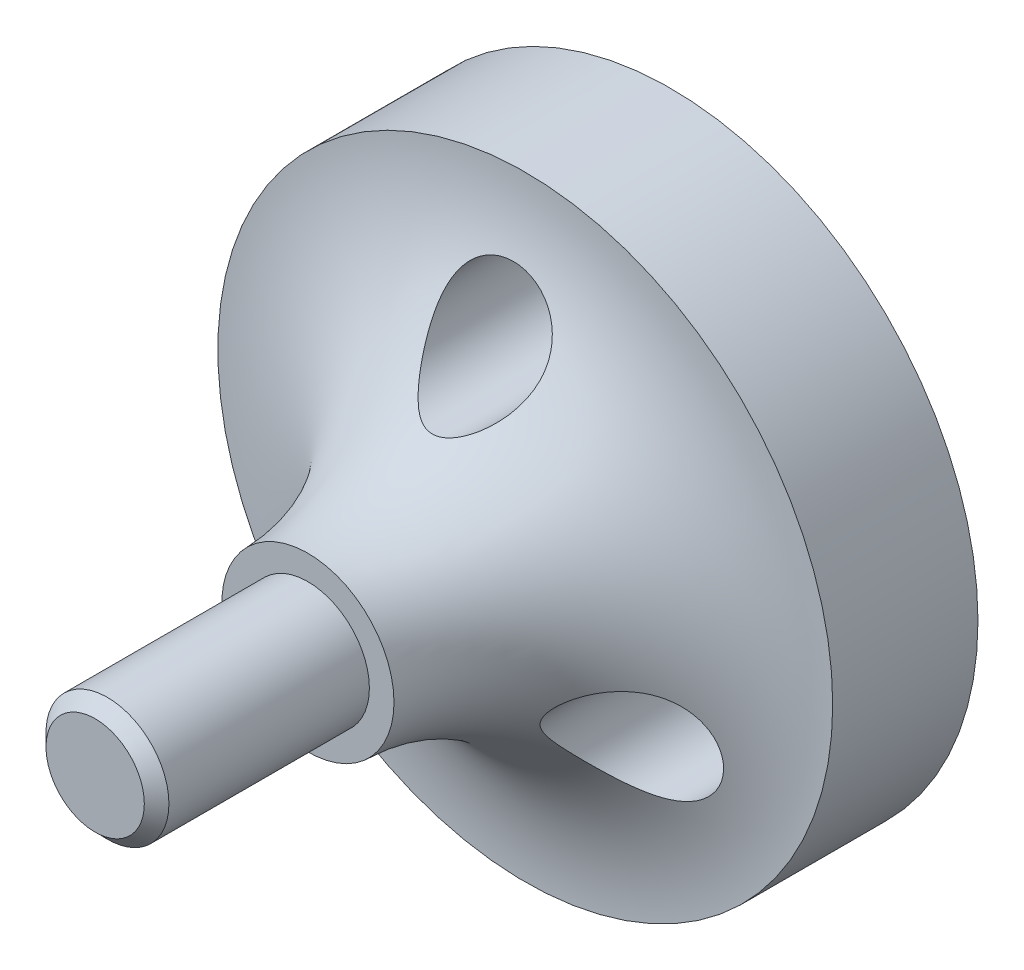
ISO-10303-21;
HEADER;
FILE_DESCRIPTION(('STEP AP214'),'2;1');
FILE_NAME('part.step','',(''),(''),'','','');
FILE_SCHEMA(('AUTOMOTIVE_DESIGN { 1 0 10303 214 1 1 1 1 }'));
ENDSEC;
DATA;
#1=APPLICATION_CONTEXT('core data for automotive mechanical design processes');
#2=APPLICATION_PROTOCOL_DEFINITION('international standard','automotive_design',2000,#1);
#3=PRODUCT_CONTEXT('',#1,'mechanical');
#4=PRODUCT('Part','Part','',(#3));
#5=PRODUCT_RELATED_PRODUCT_CATEGORY('part','',(#4));
#6=PRODUCT_DEFINITION_FORMATION('','',#4);
#7=PRODUCT_DEFINITION_CONTEXT('part definition',#1,'design');
#8=PRODUCT_DEFINITION('design','',#6,#7);
#9=PRODUCT_DEFINITION_SHAPE('','',#8);
#10=(LENGTH_UNIT() NAMED_UNIT(*) SI_UNIT(.MILLI.,.METRE.));
#11=(NAMED_UNIT(*) PLANE_ANGLE_UNIT() SI_UNIT($,.RADIAN.));
#12=(NAMED_UNIT(*) SI_UNIT($,.STERADIAN.) SOLID_ANGLE_UNIT());
#13=UNCERTAINTY_MEASURE_WITH_UNIT(LENGTH_MEASURE(1.E-05),#10,'distance_accuracy_value','');
#14=(GEOMETRIC_REPRESENTATION_CONTEXT(3) GLOBAL_UNCERTAINTY_ASSIGNED_CONTEXT((#13)) GLOBAL_UNIT_ASSIGNED_CONTEXT((#10,
#11,#12)) REPRESENTATION_CONTEXT('',''));
#15=CARTESIAN_POINT('',(0.,0.,0.));
#16=DIRECTION('',(0.,0.,1.));
#17=DIRECTION('',(1.,0.,0.));
#18=AXIS2_PLACEMENT_3D('',#15,#16,#17);
#19=CARTESIAN_POINT('',(-40.0195845164463,34.0748283091062,0.507853862000709));
#20=DIRECTION('',(0.,0.,-1.));
#21=DIRECTION('',(-1.,0.,0.));
#22=AXIS2_PLACEMENT_3D('',#19,#20,#21);
#23=CYLINDRICAL_SURFACE('',#22,6.35);
#24=CARTESIAN_POINT('',(-40.0195845164463,34.0748283091062,0.507853862000709));
#25=DIRECTION('',(0.,0.,-1.));
#26=DIRECTION('',(-1.,0.,0.));
#27=AXIS2_PLACEMENT_3D('',#24,#25,#26);
#28=CIRCLE('',#27,6.35);
#29=CARTESIAN_POINT('',(-45.8961190959622,31.668827200263,0.507853862000709));
#30=VERTEX_POINT('',#29);
#31=CARTESIAN_POINT('',(-40.8741937244126,40.3670570956062,0.507853862000709));
#32=VERTEX_POINT('',#31);
#33=EDGE_CURVE('E109',#30,#32,#28,.T.);
#34=ORIENTED_EDGE('',*,*,#33,.F.);
#35=DIRECTION('',(0.,0.,1.));
#36=VECTOR('',#35,1.);
#37=CARTESIAN_POINT('',(-45.8961190959622,31.668827200263,-0.532146137999291));
#38=LINE('',#37,#36);
#39=CARTESIAN_POINT('',(-45.8961190959622,31.668827200263,-2.03214613799929));
#40=VERTEX_POINT('',#39);
#41=EDGE_CURVE('E56',#30,#40,#38,.F.);
#42=ORIENTED_EDGE('',*,*,#41,.T.);
#43=CARTESIAN_POINT('',(-40.0195845164463,34.0748283091062,-2.03214613799929));
#44=DIRECTION('',(0.,0.,-1.));
#45=DIRECTION('',(-1.,0.,0.));
#46=AXIS2_PLACEMENT_3D('',#43,#44,#45);
#47=CIRCLE('',#46,6.35);
#48=CARTESIAN_POINT('',(-40.8741937244126,40.3670570956062,-2.03214613799929));
#49=VERTEX_POINT('',#48);
#50=EDGE_CURVE('E111',#40,#49,#47,.T.);
#51=ORIENTED_EDGE('',*,*,#50,.T.);
#52=DIRECTION('',(0.,0.,1.));
#53=VECTOR('',#52,1.);
#54=CARTESIAN_POINT('',(-40.8741937244126,40.3670570956062,-0.532146137999291));
#55=LINE('',#54,#53);
#56=EDGE_CURVE('E161',#49,#32,#55,.T.);
#57=ORIENTED_EDGE('',*,*,#56,.T.);
#58=EDGE_LOOP('',(#34,#42,#51,#57));
#59=FACE_BOUND('',#58,.T.);
#60=ADVANCED_FACE('F33',(#59),#23,.F.);
#61=CARTESIAN_POINT('',(-34.9976591448963,30.1886006314499,0.507853862000709));
#62=VERTEX_POINT('',#61);
#63=CARTESIAN_POINT('',(-45.0415098879955,30.1886006314487,0.507853862000709));
#64=VERTEX_POINT('',#63);
#65=EDGE_CURVE('E112',#62,#64,#28,.T.);
#66=ORIENTED_EDGE('',*,*,#65,.F.);
#67=DIRECTION('',(0.,0.,1.));
#68=VECTOR('',#67,1.);
#69=CARTESIAN_POINT('',(-34.9976591448963,30.1886006314499,-0.532146137999291));
#70=LINE('',#69,#68);
#71=CARTESIAN_POINT('',(-34.9976591448963,30.1886006314499,-2.03214613799929));
#72=VERTEX_POINT('',#71);
#73=EDGE_CURVE('E48',#62,#72,#70,.F.);
#74=ORIENTED_EDGE('',*,*,#73,.T.);
#75=CARTESIAN_POINT('',(-45.0415098879955,30.1886006314487,-2.03214613799929));
#76=VERTEX_POINT('',#75);
#77=EDGE_CURVE('E103',#72,#76,#47,.T.);
#78=ORIENTED_EDGE('',*,*,#77,.T.);
#79=DIRECTION('',(0.,0.,1.));
#80=VECTOR('',#79,1.);
#81=CARTESIAN_POINT('',(-45.0415098879955,30.1886006314487,-0.532146137999291));
#82=LINE('',#81,#80);
#83=EDGE_CURVE('E144',#76,#64,#82,.T.);
#84=ORIENTED_EDGE('',*,*,#83,.T.);
#85=EDGE_LOOP('',(#66,#74,#78,#84));
#86=FACE_BOUND('',#85,.T.);
#87=ADVANCED_FACE('F147',(#86),#23,.F.);
#88=CARTESIAN_POINT('',(-40.0195845164463,34.0748283091062,3.96785386200071));
#89=DIRECTION('',(0.,0.,-1.));
#90=DIRECTION('',(-1.,0.,0.));
#91=AXIS2_PLACEMENT_3D('',#88,#89,#90);
#92=CYLINDRICAL_SURFACE('',#91,12.7);
#93=CARTESIAN_POINT('',(-40.0195845164463,34.0748283091062,3.96785386200071));
#94=DIRECTION('',(0.,0.,1.));
#95=DIRECTION('',(1.,0.,0.));
#96=AXIS2_PLACEMENT_3D('',#93,#94,#95);
#97=CIRCLE('',#96,12.7);
#98=CARTESIAN_POINT('',(-27.3195845164463,34.0748283091062,3.96785386200071));
#99=VERTEX_POINT('',#98);
#100=EDGE_CURVE('E409',#99,#99,#97,.T.);
#101=ORIENTED_EDGE('',*,*,#100,.F.);
#102=EDGE_LOOP('',(#101));
#103=FACE_BOUND('',#102,.T.);
#104=CARTESIAN_POINT('',(-40.0195845164463,34.0748283091062,-2.03214613799929));
#105=DIRECTION('',(0.,0.,1.));
#106=DIRECTION('',(1.,0.,0.));
#107=AXIS2_PLACEMENT_3D('',#104,#105,#106);
#108=CIRCLE('',#107,12.7);
#109=CARTESIAN_POINT('',(-27.3195845164463,34.0748283091062,-2.03214613799929));
#110=VERTEX_POINT('',#109);
#111=EDGE_CURVE('E135',#110,#110,#108,.T.);
#112=ORIENTED_EDGE('',*,*,#111,.T.);
#113=EDGE_LOOP('',(#112));
#114=FACE_BOUND('',#113,.T.);
#115=ADVANCED_FACE('F192',(#103,#114),#92,.T.);
#116=CARTESIAN_POINT('',(-40.0195845164463,34.0748283091062,3.96785386200071));
#117=DIRECTION('',(0.,0.,1.));
#118=DIRECTION('',(1.,0.,0.));
#119=AXIS2_PLACEMENT_3D('',#116,#117,#118);
#120=PLANE('',#119);
#121=CARTESIAN_POINT('',(-40.0195845164463,34.0748283091062,3.96785386200071));
#122=DIRECTION('',(0.,0.,1.));
#123=DIRECTION('',(1.,0.,0.));
#124=AXIS2_PLACEMENT_3D('',#121,#122,#123);
#125=CIRCLE('',#124,12.6985093923933);
#126=CARTESIAN_POINT('',(-27.321075124053,34.0748283091062,3.96785386200071));
#127=VERTEX_POINT('',#126);
#128=EDGE_CURVE('E200',#127,#127,#125,.F.);
#129=ORIENTED_EDGE('',*,*,#128,.T.);
#130=EDGE_LOOP('',(#129));
#131=FACE_BOUND('',#130,.T.);
#132=ORIENTED_EDGE('',*,*,#100,.T.);
#133=EDGE_LOOP('',(#132));
#134=FACE_BOUND('',#133,.T.);
#135=ADVANCED_FACE('F224',(#131,#134),#120,.T.);
#136=CARTESIAN_POINT('',(-40.0195845164463,34.0748283091062,-2.03214613799929));
#137=DIRECTION('',(0.,0.,1.));
#138=DIRECTION('',(1.,0.,0.));
#139=AXIS2_PLACEMENT_3D('',#136,#137,#138);
#140=PLANE('',#139);
#141=ORIENTED_EDGE('',*,*,#77,.F.);
#142=CARTESIAN_POINT('',(-33.5243939880626,30.3248283091065,-2.03214613799929));
#143=DIRECTION('',(0.,0.,1.));
#144=DIRECTION('',(1.,0.,0.));
#145=AXIS2_PLACEMENT_3D('',#142,#143,#144);
#146=CIRCLE('',#145,1.47955);
#147=CARTESIAN_POINT('',(-34.1430499369304,31.6688272002632,-2.03214613799929));
#148=VERTEX_POINT('',#147);
#149=EDGE_CURVE('E88',#72,#148,#146,.T.);
#150=ORIENTED_EDGE('',*,*,#149,.T.);
#151=CARTESIAN_POINT('',(-39.1649753084801,40.3670570956062,-2.03214613799929));
#152=VERTEX_POINT('',#151);
#153=EDGE_CURVE('E101',#152,#148,#47,.T.);
#154=ORIENTED_EDGE('',*,*,#153,.F.);
#155=CARTESIAN_POINT('',(-40.0195845164463,41.5748283091062,-2.03214613799929));
#156=DIRECTION('',(0.,0.,1.));
#157=DIRECTION('',(1.,0.,0.));
#158=AXIS2_PLACEMENT_3D('',#155,#156,#157);
#159=CIRCLE('',#158,1.47955);
#160=EDGE_CURVE('E153',#152,#49,#159,.T.);
#161=ORIENTED_EDGE('',*,*,#160,.T.);
#162=ORIENTED_EDGE('',*,*,#50,.F.);
#163=CARTESIAN_POINT('',(-46.5147750448291,30.3248283091059,-2.03214613799929));
#164=DIRECTION('',(0.,0.,1.));
#165=DIRECTION('',(1.,0.,0.));
#166=AXIS2_PLACEMENT_3D('',#163,#164,#165);
#167=CIRCLE('',#166,1.47955);
#168=EDGE_CURVE('E145',#40,#76,#167,.T.);
#169=ORIENTED_EDGE('',*,*,#168,.T.);
#170=EDGE_LOOP('',(#141,#150,#154,#161,#162,#169));
#171=FACE_BOUND('',#170,.T.);
#172=ORIENTED_EDGE('',*,*,#111,.F.);
#173=EDGE_LOOP('',(#172));
#174=FACE_BOUND('',#173,.T.);
#175=ADVANCED_FACE('F98',(#171,#174),#140,.F.);
#176=CARTESIAN_POINT('',(-40.0195845164463,34.0748283091062,12.9467538620007));
#177=DIRECTION('',(0.,0.,1.));
#178=DIRECTION('',(1.,0.,0.));
#179=AXIS2_PLACEMENT_3D('',#176,#177,#178);
#180=PLANE('',#179);
#181=CARTESIAN_POINT('',(-40.0195845164463,34.0748283091062,12.9467538620007));
#182=DIRECTION('',(0.,0.,1.));
#183=DIRECTION('',(1.,0.,0.));
#184=AXIS2_PLACEMENT_3D('',#181,#182,#183);
#185=CIRCLE('',#184,2.53863134657836);
#186=CARTESIAN_POINT('',(-37.480953169868,34.0748283091062,12.9467538620007));
#187=VERTEX_POINT('',#186);
#188=EDGE_CURVE('E163',#187,#187,#185,.T.);
#189=ORIENTED_EDGE('',*,*,#188,.F.);
#190=EDGE_LOOP('',(#189));
#191=FACE_BOUND('',#190,.T.);
#192=CARTESIAN_POINT('',(-40.0195845164463,34.0748283091062,12.9467538620007));
#193=DIRECTION('',(0.,0.,1.));
#194=DIRECTION('',(1.,0.,0.));
#195=AXIS2_PLACEMENT_3D('',#192,#193,#194);
#196=CIRCLE('',#195,3.556);
#197=CARTESIAN_POINT('',(-36.4635845164463,34.0748283091062,12.9467538620007));
#198=VERTEX_POINT('',#197);
#199=EDGE_CURVE('E131',#198,#198,#196,.T.);
#200=ORIENTED_EDGE('',*,*,#199,.T.);
#201=EDGE_LOOP('',(#200));
#202=FACE_BOUND('',#201,.T.);
#203=ADVANCED_FACE('F220',(#191,#202),#180,.T.);
#204=ORIENTED_EDGE('',*,*,#153,.T.);
#205=DIRECTION('',(0.,0.,1.));
#206=VECTOR('',#205,1.);
#207=CARTESIAN_POINT('',(-34.1430499369304,31.6688272002632,-0.532146137999291));
#208=LINE('',#207,#206);
#209=CARTESIAN_POINT('',(-34.1430499369304,31.6688272002632,0.507853862000709));
#210=VERTEX_POINT('',#209);
#211=EDGE_CURVE('E85',#148,#210,#208,.T.);
#212=ORIENTED_EDGE('',*,*,#211,.T.);
#213=CARTESIAN_POINT('',(-39.1649753084801,40.3670570956062,0.507853862000709));
#214=VERTEX_POINT('',#213);
#215=EDGE_CURVE('E114',#214,#210,#28,.T.);
#216=ORIENTED_EDGE('',*,*,#215,.F.);
#217=DIRECTION('',(0.,0.,1.));
#218=VECTOR('',#217,1.);
#219=CARTESIAN_POINT('',(-39.1649753084801,40.3670570956062,-0.532146137999291));
#220=LINE('',#219,#218);
#221=EDGE_CURVE('E108',#214,#152,#220,.F.);
#222=ORIENTED_EDGE('',*,*,#221,.T.);
#223=EDGE_LOOP('',(#204,#212,#216,#222));
#224=FACE_BOUND('',#223,.T.);
#225=ADVANCED_FACE('F107',(#224),#23,.F.);
#226=CARTESIAN_POINT('',(-40.0195845164463,34.0748283091062,0.507853862000709));
#227=DIRECTION('',(0.,0.,-1.));
#228=DIRECTION('',(-1.,0.,0.));
#229=AXIS2_PLACEMENT_3D('',#226,#227,#228);
#230=PLANE('',#229);
#231=CARTESIAN_POINT('',(-33.5243939880626,30.3248283091065,0.507853862000709));
#232=DIRECTION('',(0.,0.,-1.));
#233=DIRECTION('',(-1.,0.,0.));
#234=AXIS2_PLACEMENT_3D('',#231,#232,#233);
#235=CIRCLE('',#234,1.47955);
#236=EDGE_CURVE('E89',#62,#210,#235,.T.);
#237=ORIENTED_EDGE('',*,*,#236,.F.);
#238=ORIENTED_EDGE('',*,*,#65,.T.);
#239=CARTESIAN_POINT('',(-46.5147750448291,30.3248283091059,0.507853862000709));
#240=DIRECTION('',(0.,0.,-1.));
#241=DIRECTION('',(-1.,0.,0.));
#242=AXIS2_PLACEMENT_3D('',#239,#240,#241);
#243=CIRCLE('',#242,1.47955);
#244=EDGE_CURVE('E138',#30,#64,#243,.T.);
#245=ORIENTED_EDGE('',*,*,#244,.F.);
#246=ORIENTED_EDGE('',*,*,#33,.T.);
#247=CARTESIAN_POINT('',(-40.0195845164463,41.5748283091062,0.507853862000709));
#248=DIRECTION('',(0.,0.,-1.));
#249=DIRECTION('',(-1.,0.,0.));
#250=AXIS2_PLACEMENT_3D('',#247,#248,#249);
#251=CIRCLE('',#250,1.47955);
#252=EDGE_CURVE('E155',#214,#32,#251,.T.);
#253=ORIENTED_EDGE('',*,*,#252,.F.);
#254=ORIENTED_EDGE('',*,*,#215,.T.);
#255=EDGE_LOOP('',(#237,#238,#245,#246,#253,#254));
#256=FACE_BOUND('',#255,.T.);
#257=ADVANCED_FACE('F137',(#256),#230,.T.);
#258=CARTESIAN_POINT('',(-40.0195845164463,41.5748283091062,0.967853862000709));
#259=DIRECTION('',(0.,0.,1.));
#260=DIRECTION('',(1.,0.,0.));
#261=AXIS2_PLACEMENT_3D('',#258,#259,#260);
#262=PLANE('',#261);
#263=CARTESIAN_POINT('',(-40.0195845164463,41.5748283091062,0.967853862000709));
#264=DIRECTION('',(0.,0.,1.));
#265=DIRECTION('',(1.,0.,0.));
#266=AXIS2_PLACEMENT_3D('',#263,#264,#265);
#267=CIRCLE('',#266,1.47955);
#268=CARTESIAN_POINT('',(-38.5400345164463,41.5748283091062,0.967853862000709));
#269=VERTEX_POINT('',#268);
#270=EDGE_CURVE('E149',#269,#269,#267,.T.);
#271=ORIENTED_EDGE('',*,*,#270,.F.);
#272=EDGE_LOOP('',(#271));
#273=FACE_BOUND('',#272,.T.);
#274=CARTESIAN_POINT('',(-40.0195845164463,41.5748283091062,0.967853862000709));
#275=DIRECTION('',(0.,0.,1.));
#276=DIRECTION('',(1.,0.,0.));
#277=AXIS2_PLACEMENT_3D('',#274,#275,#276);
#278=CIRCLE('',#277,2.25);
#279=CARTESIAN_POINT('',(-37.7695845164463,41.5748283091062,0.967853862000709));
#280=VERTEX_POINT('',#279);
#281=EDGE_CURVE('E116',#280,#280,#278,.T.);
#282=ORIENTED_EDGE('',*,*,#281,.T.);
#283=EDGE_LOOP('',(#282));
#284=FACE_BOUND('',#283,.T.);
#285=ADVANCED_FACE('F208',(#273,#284),#262,.T.);
#286=CARTESIAN_POINT('',(-40.0195845164463,41.5748283091062,0.967853862000709));
#287=DIRECTION('',(0.,0.,1.));
#288=DIRECTION('',(1.,0.,0.));
#289=AXIS2_PLACEMENT_3D('',#286,#287,#288);
#290=CYLINDRICAL_SURFACE('',#289,2.25);
#291=ORIENTED_EDGE('',*,*,#281,.F.);
#292=EDGE_LOOP('',(#291));
#293=FACE_BOUND('',#292,.T.);
#294=CARTESIAN_POINT('',(-42.2058924693017,42.1063897216274,5.08223381308777));
#295=CARTESIAN_POINT('',(-42.239164546029,41.969521911182,5.14942815946088));
#296=CARTESIAN_POINT('',(-42.2589204738355,41.8320602993078,5.22213607788857));
#297=CARTESIAN_POINT('',(-42.2736327732141,41.56151924504,5.37746356851469));
#298=CARTESIAN_POINT('',(-42.268566908334,41.4284438394619,5.46009196325836));
#299=CARTESIAN_POINT('',(-42.2369063961549,41.1715521944815,5.63308770468873));
#300=CARTESIAN_POINT('',(-42.2104546978442,41.0476804196931,5.72340011392995));
#301=CARTESIAN_POINT('',(-42.13943803061,40.8105966141338,5.91042110814986));
#302=CARTESIAN_POINT('',(-42.0948740575777,40.6973839976976,6.0071293412137));
#303=CARTESIAN_POINT('',(-41.9808742054196,40.4631758941099,6.22312414009203));
#304=CARTESIAN_POINT('',(-41.90839214666,40.3444971648154,6.34332293517559));
#305=CARTESIAN_POINT('',(-41.7857813973512,40.179205758565,6.52574076385759));
#306=CARTESIAN_POINT('',(-41.742535490191,40.1261730487237,6.58697570535901));
#307=CARTESIAN_POINT('',(-41.6515238360502,40.0243651789073,6.70961762561238));
#308=CARTESIAN_POINT('',(-41.6037595448408,39.9755886573085,6.77102454280991));
#309=CARTESIAN_POINT('',(-41.5093924253573,39.8876277085117,6.88640445270021));
#310=CARTESIAN_POINT('',(-41.4632771289501,39.8479835558276,6.94042741239201));
#311=CARTESIAN_POINT('',(-41.3673319327806,39.7721033198496,7.04752977771981));
#312=CARTESIAN_POINT('',(-41.3175034103341,39.7358659840625,7.10060952425532));
#313=CARTESIAN_POINT('',(-41.213914844455,39.6669661352288,7.20497431541174));
#314=CARTESIAN_POINT('',(-41.1601635275131,39.6342960680471,7.2562629896667));
#315=CARTESIAN_POINT('',(-41.0481782715156,39.5726851232828,7.3560636302677));
#316=CARTESIAN_POINT('',(-40.9899478221348,39.5437413886091,7.40457770792532));
#317=CARTESIAN_POINT('',(-40.8694168677371,39.4904700356436,7.49643470000678));
#318=CARTESIAN_POINT('',(-40.8072103627631,39.4660676255077,7.53985600927181));
#319=CARTESIAN_POINT('',(-40.6771271407118,39.4219592449656,7.62022794373303));
#320=CARTESIAN_POINT('',(-40.6092551244585,39.4022494322865,7.65718385613943));
#321=CARTESIAN_POINT('',(-40.4800916199321,39.3716448642283,7.71558704129099));
#322=CARTESIAN_POINT('',(-40.4197601134317,39.359807504069,7.73862132478092));
#323=CARTESIAN_POINT('',(-40.295673369281,39.3409541442761,7.77564426363169));
#324=CARTESIAN_POINT('',(-40.2319247543746,39.3339291577967,7.78964977682905));
#325=CARTESIAN_POINT('',(-40.1019348151846,39.3253869842624,7.80671335031046));
#326=CARTESIAN_POINT('',(-40.0356758508028,39.3239215045948,7.80966863192069));
#327=CARTESIAN_POINT('',(-39.9038062527865,39.3268394130016,7.80381894852335));
#328=CARTESIAN_POINT('',(-39.8381960033901,39.3312260800931,7.79500739043361));
#329=CARTESIAN_POINT('',(-39.7036860776881,39.3459874649251,7.7657296655081));
#330=CARTESIAN_POINT('',(-39.6350824014412,39.3569005213143,7.74421828718735));
#331=CARTESIAN_POINT('',(-39.5026165528987,39.3839748835728,7.69191600772296));
#332=CARTESIAN_POINT('',(-39.4387657388035,39.4001482949921,7.66110371444542));
#333=CARTESIAN_POINT('',(-39.273804972272,39.4492641231446,7.56981780561174));
#334=CARTESIAN_POINT('',(-39.1771627076254,39.4861011385989,7.50349153611508));
#335=CARTESIAN_POINT('',(-38.9952799526797,39.5690063275374,7.36163488803057));
#336=CARTESIAN_POINT('',(-38.9100788306128,39.615105077399,7.28607435625913));
#337=CARTESIAN_POINT('',(-38.7586478822421,39.7094848539747,7.13958519071773));
#338=CARTESIAN_POINT('',(-38.6913653257712,39.7568719160893,7.06915662214388));
#339=CARTESIAN_POINT('',(-38.5633641369578,39.8576897551061,6.9266059228383));
#340=CARTESIAN_POINT('',(-38.502649831617,39.9111244692012,6.85448271333615));
#341=CARTESIAN_POINT('',(-38.3874533084824,40.0239740147362,6.70981321213302));
#342=CARTESIAN_POINT('',(-38.3329761571148,40.0833936350888,6.63726662609156));
#343=CARTESIAN_POINT('',(-38.2303841114155,40.2081598639632,6.49277571957661));
#344=CARTESIAN_POINT('',(-38.1822688396015,40.2735061204396,6.42083136360725));
#345=CARTESIAN_POINT('',(-38.0918181404555,40.4115693686776,6.27679679629607));
#346=CARTESIAN_POINT('',(-38.0496298815549,40.484415008084,6.204736953782));
#347=CARTESIAN_POINT('',(-37.9729878227035,40.6361247023961,6.06281511760013));
#348=CARTESIAN_POINT('',(-37.9385354009616,40.7149898263787,5.99295351747232));
#349=CARTESIAN_POINT('',(-37.8783938566463,40.8781670743755,5.85633726377812));
#350=CARTESIAN_POINT('',(-37.8526801589671,40.9624631167469,5.78957436096331));
#351=CARTESIAN_POINT('',(-37.8109836936725,41.1360253807401,5.65965861106391));
#352=CARTESIAN_POINT('',(-37.7949955533682,41.2252888284146,5.59650378827289));
#353=CARTESIAN_POINT('',(-37.7701627968992,41.4403463440584,5.45270874642313));
#354=CARTESIAN_POINT('',(-37.7658542561439,41.5678807692999,5.37379846212415));
#355=CARTESIAN_POINT('',(-37.7799993280292,41.826962088947,5.2250759170814));
#356=CARTESIAN_POINT('',(-37.7984442456022,41.958507431879,5.15526019218765));
#357=CARTESIAN_POINT('',(-37.8603024281893,42.2216347050806,5.0252781857961));
#358=CARTESIAN_POINT('',(-37.9038632604668,42.3532122170752,4.96517164557858));
#359=CARTESIAN_POINT('',(-38.0167659193344,42.6096265497066,4.85562639741183));
#360=CARTESIAN_POINT('',(-38.0860968091944,42.7344662041663,4.80618317802963));
#361=CARTESIAN_POINT('',(-38.2408389647606,42.9587203000199,4.72248645812821));
#362=CARTESIAN_POINT('',(-38.3238152838989,43.0594284509426,4.68718597191531));
#363=CARTESIAN_POINT('',(-38.5074929811853,43.2461162055022,4.62467771394444));
#364=CARTESIAN_POINT('',(-38.6081875185574,43.3321014682678,4.59746682976098));
#365=CARTESIAN_POINT('',(-38.8174398371166,43.4808143300042,4.55208513851448));
#366=CARTESIAN_POINT('',(-38.9250998160421,43.5446675529126,4.53345205359401));
#367=CARTESIAN_POINT('',(-39.1502475897734,43.6538660231387,4.50236223898135));
#368=CARTESIAN_POINT('',(-39.2677337630336,43.6992143169576,4.48990449255901));
#369=CARTESIAN_POINT('',(-39.5063375816704,43.7689531011676,4.47101043239952));
#370=CARTESIAN_POINT('',(-39.6273143928564,43.79379143893,4.46444515840272));
#371=CARTESIAN_POINT('',(-39.8718698593994,43.8233495314552,4.45665279903297));
#372=CARTESIAN_POINT('',(-39.9954484032751,43.8280701464838,4.45542548540032));
#373=CARTESIAN_POINT('',(-40.240876157667,43.8172655388574,4.45825918468858));
#374=CARTESIAN_POINT('',(-40.3627313515842,43.8018669279777,4.46228712567742));
#375=CARTESIAN_POINT('',(-40.6020384583433,43.7515679772976,4.47570408814461));
#376=CARTESIAN_POINT('',(-40.7194904647196,43.7166680520033,4.48509299567421));
#377=CARTESIAN_POINT('',(-40.9467453616666,43.6285402167995,4.50951860431204));
#378=CARTESIAN_POINT('',(-41.0565441928093,43.5753026677966,4.52455827609855));
#379=CARTESIAN_POINT('',(-41.2653946681714,43.452363995783,4.56066882307005));
#380=CARTESIAN_POINT('',(-41.3644465046962,43.3826631674349,4.58173959031088));
#381=CARTESIAN_POINT('',(-41.5499427785504,43.2286562541604,4.63052471190826));
#382=CARTESIAN_POINT('',(-41.6362820653331,43.1442397380909,4.65828995504175));
#383=CARTESIAN_POINT('',(-41.793371933711,42.9642361877492,4.72074585552661));
#384=CARTESIAN_POINT('',(-41.8641217174845,42.8686485821585,4.75543686714399));
#385=CARTESIAN_POINT('',(-41.991893206777,42.6646443024566,4.8339167895387));
#386=CARTESIAN_POINT('',(-42.0480414848436,42.5558235737792,4.8780766010669));
#387=CARTESIAN_POINT('',(-42.1412117923025,42.3336033704807,4.97429567404792));
#388=CARTESIAN_POINT('',(-42.1782251480212,42.220201844495,5.02635850405385));
#389=CARTESIAN_POINT('',(-42.2058924693017,42.1063897216274,5.08223381308777));
#390=B_SPLINE_CURVE_WITH_KNOTS('',3,(#294,#295,#296,#297,#298,#299,#300,#301,#302,#303,#304,
#305,#306,#307,#308,#309,#310,#311,#312,#313,#314,#315,#316,#317,#318,#319,#320,#321,#322,#323,
#324,#325,#326,#327,#328,#329,#330,#331,#332,#333,#334,#335,#336,#337,#338,#339,#340,#341,#342,
#343,#344,#345,#346,#347,#348,#349,#350,#351,#352,#353,#354,#355,#356,#357,#358,#359,#360,#361,
#362,#363,#364,#365,#366,#367,#368,#369,#370,#371,#372,#373,#374,#375,#376,#377,#378,#379,#380,
#381,#382,#383,#384,#385,#386,#387,#388,#389),.UNSPECIFIED.,.T.,.F.,(4,2,2,2,2,2,2,2,2,2,2,2,2,
2,2,2,2,2,2,2,2,2,2,2,2,2,2,2,2,2,2,2,2,2,2,2,2,2,2,2,2,2,2,2,2,2,2,4),(0.,0.467641085404361,
0.935701180785273,1.4006582440393,1.86558974539646,2.41490450797262,2.69023203210776,
2.96547114906909,3.20935582113643,3.45315047712281,3.69641842346224,3.93949872383541,
4.17812997936143,4.41656516773886,4.61281957426352,4.80870647991204,5.00641086959537,
5.20422608158927,5.42118208703204,5.63864094410577,6.00518806482987,6.37296578676408,
6.69749866023233,7.02224404250478,7.34725137072961,7.67223940597018,8.00424201819793,
8.33630373282551,8.66742374033161,8.99836066073128,9.44651552450006,9.89449918220666,
10.3451421628546,10.7955941100223,11.1990116065711,11.6022736892081,11.9800761123467,
12.357816312046,12.7270722447428,13.0963123873124,13.4632400289753,13.8301598717837,
14.1972728795093,14.5643793170807,14.9343695785685,15.3043787706011,15.6930686381989,
16.0819345409765),.UNSPECIFIED.);
#391=CARTESIAN_POINT('',(-42.2058924693017,42.1063897216274,5.08223381308777));
#392=VERTEX_POINT('',#391);
#393=EDGE_CURVE('E122',#392,#392,#390,.T.);
#394=ORIENTED_EDGE('',*,*,#393,.T.);
#395=EDGE_LOOP('',(#394));
#396=FACE_BOUND('',#395,.T.);
#397=ADVANCED_FACE('F202',(#293,#396),#290,.F.);
#398=CARTESIAN_POINT('',(-46.5147750448291,30.3248283091059,0.967853862000709));
#399=DIRECTION('',(0.,0.,1.));
#400=DIRECTION('',(1.,0.,0.));
#401=AXIS2_PLACEMENT_3D('',#398,#399,#400);
#402=PLANE('',#401);
#403=CARTESIAN_POINT('',(-46.5147750448291,30.3248283091059,0.967853862000709));
#404=DIRECTION('',(0.,0.,1.));
#405=DIRECTION('',(1.,0.,0.));
#406=AXIS2_PLACEMENT_3D('',#403,#404,#405);
#407=CIRCLE('',#406,1.47955);
#408=CARTESIAN_POINT('',(-45.0352250448291,30.3248283091059,0.967853862000709));
#409=VERTEX_POINT('',#408);
#410=EDGE_CURVE('E235',#409,#409,#407,.T.);
#411=ORIENTED_EDGE('',*,*,#410,.F.);
#412=EDGE_LOOP('',(#411));
#413=FACE_BOUND('',#412,.T.);
#414=CARTESIAN_POINT('',(-46.5147750448291,30.3248283091059,0.967853862000709));
#415=DIRECTION('',(0.,0.,1.));
#416=DIRECTION('',(1.,0.,0.));
#417=AXIS2_PLACEMENT_3D('',#414,#415,#416);
#418=CIRCLE('',#417,2.25);
#419=CARTESIAN_POINT('',(-44.2647750448291,30.3248283091059,0.967853862000709));
#420=VERTEX_POINT('',#419);
#421=EDGE_CURVE('E127',#420,#420,#418,.T.);
#422=ORIENTED_EDGE('',*,*,#421,.T.);
#423=EDGE_LOOP('',(#422));
#424=FACE_BOUND('',#423,.T.);
#425=ADVANCED_FACE('F207',(#413,#424),#402,.T.);
#426=CARTESIAN_POINT('',(-46.5147750448291,30.3248283091059,0.967853862000709));
#427=DIRECTION('',(0.,0.,1.));
#428=DIRECTION('',(1.,0.,0.));
#429=AXIS2_PLACEMENT_3D('',#426,#427,#428);
#430=CYLINDRICAL_SURFACE('',#429,2.25);
#431=ORIENTED_EDGE('',*,*,#421,.F.);
#432=EDGE_LOOP('',(#431));
#433=FACE_BOUND('',#432,.T.);
#434=CARTESIAN_POINT('',(-48.7634833717314,30.2485993085824,4.52905688024794));
#435=CARTESIAN_POINT('',(-48.7593653110169,30.1273047030342,4.51257194823051));
#436=CARTESIAN_POINT('',(-48.7453845320864,30.0058184760399,4.49903358237727));
#437=CARTESIAN_POINT('',(-48.6977366609759,29.7661193813479,4.47751332213073));
#438=CARTESIAN_POINT('',(-48.6640379310992,29.64791209474,4.46954040275384));
#439=CARTESIAN_POINT('',(-48.5777569685804,29.4183956445114,4.45893119177901));
#440=CARTESIAN_POINT('',(-48.5251840216798,29.3070831203241,4.45629228018015));
#441=CARTESIAN_POINT('',(-48.4026222350982,29.0945524003297,4.45625984432671));
#442=CARTESIAN_POINT('',(-48.3326392262598,28.993330840801,4.45886456598239));
#443=CARTESIAN_POINT('',(-48.1774512747095,28.8039866472155,4.46938962085979));
#444=CARTESIAN_POINT('',(-48.0922778512994,28.7158375691973,4.47729903918252));
#445=CARTESIAN_POINT('',(-47.9091663417402,28.554788797848,4.49866557224007));
#446=CARTESIAN_POINT('',(-47.8112278615107,28.4818895754886,4.51212285827533));
#447=CARTESIAN_POINT('',(-47.6053192093811,28.3530264867829,4.54499083947267));
#448=CARTESIAN_POINT('',(-47.4973229402451,28.2971083772297,4.56441734098979));
#449=CARTESIAN_POINT('',(-47.2749051994704,28.2036841538085,4.60963056001937));
#450=CARTESIAN_POINT('',(-47.1604837604645,28.1661779464382,4.63541724523149));
#451=CARTESIAN_POINT('',(-46.9273507875852,28.1096889956194,4.69410547076698));
#452=CARTESIAN_POINT('',(-46.808603723033,28.0909407355114,4.72709094584205));
#453=CARTESIAN_POINT('',(-46.5718776473596,28.0724203911321,4.80026238455766));
#454=CARTESIAN_POINT('',(-46.4538986905799,28.0726496351875,4.84044885203386));
#455=CARTESIAN_POINT('',(-46.2180926458736,28.0912330261968,4.92962187437505));
#456=CARTESIAN_POINT('',(-46.1004133500173,28.110216840044,4.97886573888583));
#457=CARTESIAN_POINT('',(-45.8727278495983,28.1651969558294,5.08492757021612));
#458=CARTESIAN_POINT('',(-45.762723683221,28.2011977571655,5.14174753735037));
#459=CARTESIAN_POINT('',(-45.5446249632733,28.2910437806932,5.2671531804165));
#460=CARTESIAN_POINT('',(-45.437344003544,28.3460588692732,5.33631018142964));
#461=CARTESIAN_POINT('',(-45.2363671391732,28.4695368619852,5.48188015294443));
#462=CARTESIAN_POINT('',(-45.1426765063887,28.5380049605867,5.55829592029146));
#463=CARTESIAN_POINT('',(-44.9576492401978,28.695528421373,5.72832445764316));
#464=CARTESIAN_POINT('',(-44.8684706955055,28.7861236334816,5.82284820121476));
#465=CARTESIAN_POINT('',(-44.7089172288272,28.9769127394098,6.01795423219745));
#466=CARTESIAN_POINT('',(-44.6385582899357,29.0771146945561,6.11854158103311));
#467=CARTESIAN_POINT('',(-44.5405736280934,29.243039882438,6.28269719700917));
#468=CARTESIAN_POINT('',(-44.5070892959619,29.3065993719984,6.34505242042045));
#469=CARTESIAN_POINT('',(-44.4466046601183,29.4358611945003,6.47067636099217));
#470=CARTESIAN_POINT('',(-44.4196036136121,29.5015632809826,6.53394497262378));
#471=CARTESIAN_POINT('',(-44.3719774944851,29.6349446608391,6.6608804403904));
#472=CARTESIAN_POINT('',(-44.35135630721,29.7026251317039,6.72454751520838));
#473=CARTESIAN_POINT('',(-44.3165197239225,29.8398732266122,6.8515368307455));
#474=CARTESIAN_POINT('',(-44.3023025651577,29.9094403257518,6.91485916161095));
#475=CARTESIAN_POINT('',(-44.2760063441521,30.0789371608377,7.06552476942034));
#476=CARTESIAN_POINT('',(-44.2670601211179,30.1798758694563,7.15233922161295));
#477=CARTESIAN_POINT('',(-44.2642077627059,30.3349934872708,7.27806800101658));
#478=CARTESIAN_POINT('',(-44.2650158614754,30.3872973426244,7.31921421202263));
#479=CARTESIAN_POINT('',(-44.2704674719421,30.4933657505492,7.39929622887626));
#480=CARTESIAN_POINT('',(-44.275109368603,30.5471296788241,7.43823295811611));
#481=CARTESIAN_POINT('',(-44.2903721285301,30.6702340252367,7.52246498624733));
#482=CARTESIAN_POINT('',(-44.3022135639394,30.74005771894,7.5668581547277));
#483=CARTESIAN_POINT('',(-44.3337631390212,30.882487875798,7.64776831617176));
#484=CARTESIAN_POINT('',(-44.3534575971118,30.9550893017319,7.6842988379367));
#485=CARTESIAN_POINT('',(-44.3958481236159,31.0837745903662,7.73759983273556));
#486=CARTESIAN_POINT('',(-44.4165273857957,31.1393952759152,7.75703099642145));
#487=CARTESIAN_POINT('',(-44.4632397092677,31.2507501093306,7.78711390760806));
#488=CARTESIAN_POINT('',(-44.4892635634419,31.306483901003,7.79778059768477));
#489=CARTESIAN_POINT('',(-44.5465234919841,31.416782343178,7.80891277874995));
#490=CARTESIAN_POINT('',(-44.5777921461678,31.471337117148,7.80931193568839));
#491=CARTESIAN_POINT('',(-44.64433943363,31.576978357282,7.7996757732131));
#492=CARTESIAN_POINT('',(-44.6796215054119,31.6280617886037,7.78963144543822));
#493=CARTESIAN_POINT('',(-44.7597281023959,31.7346363599916,7.75780191958299));
#494=CARTESIAN_POINT('',(-44.8050983318918,31.7891456294032,7.73416174367155));
#495=CARTESIAN_POINT('',(-44.8979488259799,31.8910849246501,7.67758234551501));
#496=CARTESIAN_POINT('',(-44.9454339865058,31.9384972842743,7.64462048891634));
#497=CARTESIAN_POINT('',(-45.0348281593411,32.0205289928804,7.57748403768392));
#498=CARTESIAN_POINT('',(-45.0765836144821,32.0560098526886,7.54413001848602));
#499=CARTESIAN_POINT('',(-45.1607896098654,32.1226336387707,7.47409923695494));
#500=CARTESIAN_POINT('',(-45.2032406549803,32.1537732426729,7.43741996484118));
#501=CARTESIAN_POINT('',(-45.3317117555617,32.2415109800151,7.32376805510088));
#502=CARTESIAN_POINT('',(-45.4186658683526,32.2922643397048,7.24332849804401));
#503=CARTESIAN_POINT('',(-45.5824406371053,32.3743095155011,7.09007240201834));
#504=CARTESIAN_POINT('',(-45.6589395753387,32.407343999131,7.0178030331444));
#505=CARTESIAN_POINT('',(-45.8140119348227,32.464515937663,6.87186157482287));
#506=CARTESIAN_POINT('',(-45.892586645924,32.4886477142579,6.79818862153419));
#507=CARTESIAN_POINT('',(-46.0517552883706,32.5281960155245,6.65081085396355));
#508=CARTESIAN_POINT('',(-46.1323478176617,32.5436184253946,6.57710609495782));
#509=CARTESIAN_POINT('',(-46.2955418771489,32.5656351222176,6.43053481836808));
#510=CARTESIAN_POINT('',(-46.3781439851418,32.5722268388709,6.3576685509547));
#511=CARTESIAN_POINT('',(-46.5324347982787,32.575874513842,6.22447441907559));
#512=CARTESIAN_POINT('',(-46.6038916567467,32.5742181132277,6.16391222479287));
#513=CARTESIAN_POINT('',(-46.7476766422964,32.5639019697001,6.04444883040674));
#514=CARTESIAN_POINT('',(-46.8200046070806,32.5552435120617,5.98554732752542));
#515=CARTESIAN_POINT('',(-46.9649705506251,32.5305525298993,5.86990490616972));
#516=CARTESIAN_POINT('',(-47.0376079076727,32.5145310009233,5.81316090215199));
#517=CARTESIAN_POINT('',(-47.1826342728097,32.4747399255482,5.70216867022718));
#518=CARTESIAN_POINT('',(-47.2550233285582,32.4509719610796,5.64791993533018));
#519=CARTESIAN_POINT('',(-47.4443105732339,32.3777022778962,5.50885023064042));
#520=CARTESIAN_POINT('',(-47.5604187802614,32.3214308566054,5.42638056761786));
#521=CARTESIAN_POINT('',(-47.7855546686453,32.1862282039326,5.27060005117134));
#522=CARTESIAN_POINT('',(-47.8945840984384,32.1073025943763,5.19728693194445));
#523=CARTESIAN_POINT('',(-48.0489838454596,31.9720839078205,5.09488283871512));
#524=CARTESIAN_POINT('',(-48.0990954052776,31.9239954298109,5.06190073094336));
#525=CARTESIAN_POINT('',(-48.1954088639483,31.8224456841613,4.99863895346015));
#526=CARTESIAN_POINT('',(-48.241612593487,31.7689869582676,4.96835801797338));
#527=CARTESIAN_POINT('',(-48.329408149102,31.6569955799794,4.9105450479155));
#528=CARTESIAN_POINT('',(-48.3709986721379,31.5984615022835,4.88301379023254));
#529=CARTESIAN_POINT('',(-48.4488483201895,31.4768186208075,4.83073613707834));
#530=CARTESIAN_POINT('',(-48.4851082810133,31.4137105365327,4.80598930516485));
#531=CARTESIAN_POINT('',(-48.5772999983668,31.2332416307007,4.74125214558967));
#532=CARTESIAN_POINT('',(-48.6269054007403,31.111493443899,4.70418098516992));
#533=CARTESIAN_POINT('',(-48.7043158739284,30.8593842566213,4.63845174548983));
#534=CARTESIAN_POINT('',(-48.7321705871247,30.7290436093438,4.60977460241314));
#535=CARTESIAN_POINT('',(-48.7552895596697,30.5392235961633,4.57424622059296));
#536=CARTESIAN_POINT('',(-48.7600761713172,30.4813620634351,4.56422424280185));
#537=CARTESIAN_POINT('',(-48.7651632293339,30.3652148916158,4.54559333981279));
#538=CARTESIAN_POINT('',(-48.7654637258377,30.3069292572713,4.53698439882448));
#539=CARTESIAN_POINT('',(-48.7634833717314,30.2485993085824,4.52905688024794));
#540=B_SPLINE_CURVE_WITH_KNOTS('',3,(#434,#435,#436,#437,#438,#439,#440,#441,#442,#443,#444,
#445,#446,#447,#448,#449,#450,#451,#452,#453,#454,#455,#456,#457,#458,#459,#460,#461,#462,#463,
#464,#465,#466,#467,#468,#469,#470,#471,#472,#473,#474,#475,#476,#477,#478,#479,#480,#481,#482,
#483,#484,#485,#486,#487,#488,#489,#490,#491,#492,#493,#494,#495,#496,#497,#498,#499,#500,#501,
#502,#503,#504,#505,#506,#507,#508,#509,#510,#511,#512,#513,#514,#515,#516,#517,#518,#519,#520,
#521,#522,#523,#524,#525,#526,#527,#528,#529,#530,#531,#532,#533,#534,#535,#536,#537,#538,#539),
.UNSPECIFIED.,.T.,.F.,(4,2,2,2,2,2,2,2,2,2,2,2,2,2,2,2,2,2,2,2,2,2,2,2,2,2,2,2,2,2,2,2,2,2,2,2,
2,2,2,2,2,2,2,2,2,2,2,2,2,2,2,2,4),(0.,0.367218502350869,0.735027833345094,1.10265645684229,
1.47016212238066,1.83691392184023,2.20367704627249,2.57141984532094,2.9391607768181,
3.31144327139559,3.68375182383777,4.06900022316738,4.45435054161347,4.86966467186591,
5.28513947925595,5.75866718610834,6.23259578228045,6.5177555815936,6.8028826943652,
7.08818310979796,7.37340494628868,7.7727757744398,7.97231182847737,8.1717638682545,
8.42195339819832,8.67170893775213,8.85833844134387,9.0446490956584,9.23216312156692,
9.41983902797876,9.64286167938179,9.86643058061322,10.0585985012033,10.2509126903057,
10.6363928786813,10.9669415251299,11.2977006384485,11.6282359789615,11.9588675056271,
12.239659572371,12.520400109529,12.8007227619179,13.0809882043334,13.5384161587552,
13.9957306966124,14.2261073940631,14.4563755630654,14.6867086085852,14.9170055003204,
15.3244723814604,15.7310065457644,15.9076019984934,16.0841954776752),.UNSPECIFIED.);
#541=CARTESIAN_POINT('',(-48.7634833717314,30.2485993085824,4.52905688024794));
#542=VERTEX_POINT('',#541);
#543=EDGE_CURVE('E168',#542,#542,#540,.T.);
#544=ORIENTED_EDGE('',*,*,#543,.T.);
#545=EDGE_LOOP('',(#544));
#546=FACE_BOUND('',#545,.T.);
#547=ADVANCED_FACE('F247',(#433,#546),#430,.F.);
#548=CARTESIAN_POINT('',(-33.5243939880626,30.3248283091065,0.967853862000709));
#549=DIRECTION('',(0.,0.,1.));
#550=DIRECTION('',(1.,0.,0.));
#551=AXIS2_PLACEMENT_3D('',#548,#549,#550);
#552=PLANE('',#551);
#553=CARTESIAN_POINT('',(-33.5243939880626,30.3248283091065,0.967853862000709));
#554=DIRECTION('',(0.,0.,1.));
#555=DIRECTION('',(1.,0.,0.));
#556=AXIS2_PLACEMENT_3D('',#553,#554,#555);
#557=CIRCLE('',#556,1.47955);
#558=CARTESIAN_POINT('',(-32.0448439880626,30.3248283091065,0.967853862000709));
#559=VERTEX_POINT('',#558);
#560=EDGE_CURVE('E104',#559,#559,#557,.T.);
#561=ORIENTED_EDGE('',*,*,#560,.F.);
#562=EDGE_LOOP('',(#561));
#563=FACE_BOUND('',#562,.T.);
#564=CARTESIAN_POINT('',(-33.5243939880626,30.3248283091065,0.967853862000709));
#565=DIRECTION('',(0.,0.,1.));
#566=DIRECTION('',(1.,0.,0.));
#567=AXIS2_PLACEMENT_3D('',#564,#565,#566);
#568=CIRCLE('',#567,2.25);
#569=CARTESIAN_POINT('',(-31.2743939880626,30.3248283091065,0.967853862000709));
#570=VERTEX_POINT('',#569);
#571=EDGE_CURVE('E166',#570,#570,#568,.T.);
#572=ORIENTED_EDGE('',*,*,#571,.T.);
#573=EDGE_LOOP('',(#572));
#574=FACE_BOUND('',#573,.T.);
#575=ADVANCED_FACE('F245',(#563,#574),#552,.T.);
#576=CARTESIAN_POINT('',(-33.5243939880626,30.3248283091065,0.967853862000709));
#577=DIRECTION('',(0.,0.,1.));
#578=DIRECTION('',(1.,0.,0.));
#579=AXIS2_PLACEMENT_3D('',#576,#577,#578);
#580=CYLINDRICAL_SURFACE('',#579,2.25);
#581=ORIENTED_EDGE('',*,*,#571,.F.);
#582=EDGE_LOOP('',(#581));
#583=FACE_BOUND('',#582,.T.);
#584=CARTESIAN_POINT('',(-35.2180782753319,28.8436350283166,5.88155711961516));
#585=CARTESIAN_POINT('',(-35.168117223268,28.7865071029044,5.82281721293471));
#586=CARTESIAN_POINT('',(-35.1146718177364,28.7312265473511,5.76522241900637));
#587=CARTESIAN_POINT('',(-35.00080045962,28.6251873834331,5.65274237992021));
#588=CARTESIAN_POINT('',(-34.940371382152,28.5744308174853,5.59785836351549));
#589=CARTESIAN_POINT('',(-34.8127057872432,28.4784466915347,5.49123898536154));
#590=CARTESIAN_POINT('',(-34.7454700427839,28.4332185050007,5.43950326715003));
#591=CARTESIAN_POINT('',(-34.6046047828091,28.3493877085096,5.33958483377153));
#592=CARTESIAN_POINT('',(-34.5309784447536,28.3107818339785,5.29140037467542));
#593=CARTESIAN_POINT('',(-34.3435862692306,28.2257334083162,5.17816632912219));
#594=CARTESIAN_POINT('',(-34.2265827463199,28.183494874257,5.1151990487142));
#595=CARTESIAN_POINT('',(-33.9832009280216,28.118508468886,4.99810681473801));
#596=CARTESIAN_POINT('',(-33.8568304533714,28.0957445324907,4.94397460279216));
#597=CARTESIAN_POINT('',(-33.5979917792959,28.0722677022795,4.84457875202267));
#598=CARTESIAN_POINT('',(-33.465500546403,28.0716462911068,4.7993526736008));
#599=CARTESIAN_POINT('',(-33.1997449000105,28.0943851053062,4.71796748815663));
#600=CARTESIAN_POINT('',(-33.0664805444468,28.117743556188,4.68180771048185));
#601=CARTESIAN_POINT('',(-32.8141984890904,28.1861541355225,4.62050227133623));
#602=CARTESIAN_POINT('',(-32.6948575128262,28.2294674449786,4.5947383228603));
#603=CARTESIAN_POINT('',(-32.4641577824415,28.336225507802,4.5501435883859));
#604=CARTESIAN_POINT('',(-32.3527968928231,28.3996648505268,4.53131094192606));
#605=CARTESIAN_POINT('',(-32.145841026662,28.5423298480986,4.50067910338954));
#606=CARTESIAN_POINT('',(-32.0498122669814,28.6208766202918,4.48864327420884));
#607=CARTESIAN_POINT('',(-31.8717090927195,28.7930106132882,4.47019587410348));
#608=CARTESIAN_POINT('',(-31.7896334884253,28.8865965504553,4.46378382347438));
#609=CARTESIAN_POINT('',(-31.6428416620324,29.0849481014165,4.45642064266997));
#610=CARTESIAN_POINT('',(-31.5779282655596,29.1895654885775,4.45540467001362));
#611=CARTESIAN_POINT('',(-31.4660414181324,29.4079141283335,4.45862520827216));
#612=CARTESIAN_POINT('',(-31.4190675175847,29.5216451524394,4.46286158754315));
#613=CARTESIAN_POINT('',(-31.3444049635568,29.7546683963746,4.47670815122447));
#614=CARTESIAN_POINT('',(-31.3166724653427,29.8739473076567,4.48630602780838));
#615=CARTESIAN_POINT('',(-31.2809075683714,30.1148402967149,4.5111512869155));
#616=CARTESIAN_POINT('',(-31.2728747756597,30.2364543277442,4.52639855645518));
#617=CARTESIAN_POINT('',(-31.276393273886,30.4789337500128,4.56299805096249));
#618=CARTESIAN_POINT('',(-31.2880178799533,30.5997946437708,4.58437288247239));
#619=CARTESIAN_POINT('',(-31.3301126574535,30.8368020361729,4.63362559850119));
#620=CARTESIAN_POINT('',(-31.3605829345455,30.9529485083814,4.66150351947944));
#621=CARTESIAN_POINT('',(-31.4393304650965,31.1789590513637,4.7245925450733));
#622=CARTESIAN_POINT('',(-31.4878636435866,31.2887052442576,4.75990571095803));
#623=CARTESIAN_POINT('',(-31.6002877531849,31.4971531173576,4.83783009721043));
#624=CARTESIAN_POINT('',(-31.6641800388833,31.5958538222855,4.88044196118845));
#625=CARTESIAN_POINT('',(-31.8072472125461,31.7837316519516,4.97481064131845));
#626=CARTESIAN_POINT('',(-31.8869306268813,31.8723708538057,5.02686476635088));
#627=CARTESIAN_POINT('',(-32.0562888693419,32.0338858981805,5.13854638650381));
#628=CARTESIAN_POINT('',(-32.1459668582572,32.1067567323918,5.19817627830389));
#629=CARTESIAN_POINT('',(-32.3399314736234,32.2417770835936,5.32986093775976));
#630=CARTESIAN_POINT('',(-32.4448108460177,32.3024563602942,5.40254407453009));
#631=CARTESIAN_POINT('',(-32.6584632174285,32.4049059701144,5.55504160939972));
#632=CARTESIAN_POINT('',(-32.7672374543915,32.4466702326615,5.63485828710654));
#633=CARTESIAN_POINT('',(-33.00203779116,32.5172814197353,5.81277279529378));
#634=CARTESIAN_POINT('',(-33.1282039040745,32.5432504752943,5.91181679601217));
#635=CARTESIAN_POINT('',(-33.3786175099191,32.573650520987,6.11565265953213));
#636=CARTESIAN_POINT('',(-33.5028623599239,32.5780540890267,6.22045166920517));
#637=CARTESIAN_POINT('',(-33.6991627564157,32.5692528073106,6.39127022111374));
#638=CARTESIAN_POINT('',(-33.7724656125183,32.5623107261327,6.45627346942359));
#639=CARTESIAN_POINT('',(-33.9174959728825,32.5414334983974,6.58690675764437));
#640=CARTESIAN_POINT('',(-33.989223710133,32.5274993934609,6.6525367027664));
#641=CARTESIAN_POINT('',(-34.1309992906269,32.4927437971039,6.78371468960239));
#642=CARTESIAN_POINT('',(-34.2010478874786,32.4719254598785,6.84926275505134));
#643=CARTESIAN_POINT('',(-34.3395100792518,32.4232726200929,6.97942296543011));
#644=CARTESIAN_POINT('',(-34.4079243847062,32.3954412296637,7.04403551209453));
#645=CARTESIAN_POINT('',(-34.5514117271198,32.3285115816129,7.17885211987535));
#646=CARTESIAN_POINT('',(-34.6262939468699,32.2884598773284,7.24879196966654));
#647=CARTESIAN_POINT('',(-34.7743329225267,32.1977125840145,7.38355814452434));
#648=CARTESIAN_POINT('',(-34.8474903711878,32.1470213522506,7.44838654800478));
#649=CARTESIAN_POINT('',(-34.9755519404623,32.0457902486946,7.55493170300005));
#650=CARTESIAN_POINT('',(-35.0308477847865,31.9978005684695,7.59856179024154));
#651=CARTESIAN_POINT('',(-35.139618180229,31.8930173667255,7.67662345901238));
#652=CARTESIAN_POINT('',(-35.1930969996641,31.8362465105756,7.71107811731117));
#653=CARTESIAN_POINT('',(-35.2815285309557,31.731318160594,7.75807325627557));
#654=CARTESIAN_POINT('',(-35.3173414456387,31.6854659610684,7.77407343949436));
#655=CARTESIAN_POINT('',(-35.386169385368,31.5896431692221,7.79731709774578));
#656=CARTESIAN_POINT('',(-35.4191885600201,31.53967891043,7.80457377980779));
#657=CARTESIAN_POINT('',(-35.4813998885541,31.436699252535,7.80935924488688));
#658=CARTESIAN_POINT('',(-35.5105771213438,31.3836730450741,7.80685119316541));
#659=CARTESIAN_POINT('',(-35.5641161071695,31.2764777723395,7.79239568965262));
#660=CARTESIAN_POINT('',(-35.5884724200212,31.2223074914315,7.7804376490738));
#661=CARTESIAN_POINT('',(-35.6385025671844,31.09858914981,7.74393315316221));
#662=CARTESIAN_POINT('',(-35.6624908208804,31.0291614714202,7.7167332645883));
#663=CARTESIAN_POINT('',(-35.7028054057307,30.8924057926773,7.65298962459747));
#664=CARTESIAN_POINT('',(-35.7191114482177,30.8250837858049,7.6164215201738));
#665=CARTESIAN_POINT('',(-35.7435795514699,30.7006569297406,7.54177378284895));
#666=CARTESIAN_POINT('',(-35.7524703867815,30.6432771502162,7.50436958687431));
#667=CARTESIAN_POINT('',(-35.7657195346376,30.5302556554186,7.4262316454067));
#668=CARTESIAN_POINT('',(-35.7700742067695,30.4746153708232,7.3854952539534));
#669=CARTESIAN_POINT('',(-35.7747137047818,30.3647373224658,7.30166020117625));
#670=CARTESIAN_POINT('',(-35.7749866986073,30.3105040909488,7.25855503556035));
#671=CARTESIAN_POINT('',(-35.7717526733704,30.2033834527743,7.17083015696618));
#672=CARTESIAN_POINT('',(-35.768244504742,30.1504964604116,7.12620998738501));
#673=CARTESIAN_POINT('',(-35.7543729108977,30.0134417134437,7.00802768178863));
#674=CARTESIAN_POINT('',(-35.7411064200497,29.9302281119442,6.93368772707226));
#675=CARTESIAN_POINT('',(-35.7056195114482,29.766463790508,6.7841480706577));
#676=CARTESIAN_POINT('',(-35.6833933359726,29.6859148190163,6.70894784637933));
#677=CARTESIAN_POINT('',(-35.6301204730279,29.5277356529314,6.55911967891396));
#678=CARTESIAN_POINT('',(-35.5991015908275,29.4500971172706,6.48449068145098));
#679=CARTESIAN_POINT('',(-35.5280929112215,29.2978233940791,6.33654358093139));
#680=CARTESIAN_POINT('',(-35.4881099676375,29.2231859630861,6.26322452230967));
#681=CARTESIAN_POINT('',(-35.4109452182635,29.0970990775899,6.13811036120507));
#682=CARTESIAN_POINT('',(-35.3759036647455,29.0448133976781,6.08583128423836));
#683=CARTESIAN_POINT('',(-35.3007827732014,28.9424471652542,5.98260846144211));
#684=CARTESIAN_POINT('',(-35.2606983435112,28.8923689115204,5.93166612901658));
#685=CARTESIAN_POINT('',(-35.2180782753319,28.8436350283166,5.88155711961516));
#686=B_SPLINE_CURVE_WITH_KNOTS('',3,(#584,#585,#586,#587,#588,#589,#590,#591,#592,#593,#594,
#595,#596,#597,#598,#599,#600,#601,#602,#603,#604,#605,#606,#607,#608,#609,#610,#611,#612,#613,
#614,#615,#616,#617,#618,#619,#620,#621,#622,#623,#624,#625,#626,#627,#628,#629,#630,#631,#632,
#633,#634,#635,#636,#637,#638,#639,#640,#641,#642,#643,#644,#645,#646,#647,#648,#649,#650,#651,
#652,#653,#654,#655,#656,#657,#658,#659,#660,#661,#662,#663,#664,#665,#666,#667,#668,#669,#670,
#671,#672,#673,#674,#675,#676,#677,#678,#679,#680,#681,#682,#683,#684,#685),.UNSPECIFIED.,.T.,
.F.,(4,2,2,2,2,2,2,2,2,2,2,2,2,2,2,2,2,2,2,2,2,2,2,2,2,2,2,2,2,2,2,2,2,2,2,2,2,2,2,2,2,2,2,2,2,
2,2,2,2,2,4),(0.,0.287829257654318,0.575787808448017,0.863713694584793,1.15149723261009,
1.56784674010929,1.98385245837431,2.40157672088013,2.81927007436095,3.20596153508491,
3.59254912642027,3.96468327209971,4.33678567190568,4.70440638107744,5.0720178764633,
5.43878893226085,5.80555265331363,6.17368729206944,6.54182399480828,6.91538856538341,
7.28898609442846,7.67750732721939,8.06615178060608,8.48837412485907,8.91073188102363,
9.39645280013271,9.88279118882078,10.1772148472893,10.4715946576787,10.7658397765359,
11.0599545496456,11.3895042135006,11.7189191774557,11.9739545058958,12.2283422136764,
12.4086576091928,12.5887002960776,12.7694228006771,12.9503480938956,13.1840134951379,
13.4182925928938,13.6252074366243,13.8322882083485,14.0399691541689,14.2477132578953,
14.5843704577712,14.9212443479252,15.2570646004094,15.5926289588525,15.8379165951921,
16.0834539103306),.UNSPECIFIED.);
#687=CARTESIAN_POINT('',(-35.2180782753319,28.8436350283166,5.88155711961516));
#688=VERTEX_POINT('',#687);
#689=EDGE_CURVE('E165',#688,#688,#686,.T.);
#690=ORIENTED_EDGE('',*,*,#689,.T.);
#691=EDGE_LOOP('',(#690));
#692=FACE_BOUND('',#691,.T.);
#693=ADVANCED_FACE('F183',(#583,#692),#580,.F.);
#694=CARTESIAN_POINT('',(-40.0195845164463,34.0748283091062,28.9154876223939));
#695=DIRECTION('',(0.,0.,-1.));
#696=DIRECTION('',(-1.,0.,0.));
#697=AXIS2_PLACEMENT_3D('',#694,#695,#696);
#698=CYLINDRICAL_SURFACE('',#697,2.53863134657836);
#699=CARTESIAN_POINT('',(-40.0195845164463,34.0748283091062,21.2271538620007));
#700=DIRECTION('',(0.,0.,1.));
#701=DIRECTION('',(1.,0.,0.));
#702=AXIS2_PLACEMENT_3D('',#699,#700,#701);
#703=CIRCLE('',#702,2.53863134657836);
#704=CARTESIAN_POINT('',(-37.480953169868,34.0748283091062,21.2271538620007));
#705=VERTEX_POINT('',#704);
#706=EDGE_CURVE('E11',#705,#705,#703,.F.);
#707=ORIENTED_EDGE('',*,*,#706,.T.);
#708=EDGE_LOOP('',(#707));
#709=FACE_BOUND('',#708,.T.);
#710=ORIENTED_EDGE('',*,*,#188,.T.);
#711=EDGE_LOOP('',(#710));
#712=FACE_BOUND('',#711,.T.);
#713=ADVANCED_FACE('F214',(#709,#712),#698,.T.);
#714=CARTESIAN_POINT('',(-40.0195845164463,34.0748283091062,21.7351538620007));
#715=DIRECTION('',(0.,0.,1.));
#716=DIRECTION('',(1.,0.,0.));
#717=AXIS2_PLACEMENT_3D('',#714,#715,#716);
#718=PLANE('',#717);
#719=CARTESIAN_POINT('',(-40.0195845164463,34.0748283091062,21.7351538620007));
#720=DIRECTION('',(0.,0.,1.));
#721=DIRECTION('',(1.,0.,0.));
#722=AXIS2_PLACEMENT_3D('',#719,#720,#721);
#723=CIRCLE('',#722,2.03063134657835);
#724=CARTESIAN_POINT('',(-37.988953169868,34.0748283091062,21.7351538620007));
#725=VERTEX_POINT('',#724);
#726=EDGE_CURVE('E41',#725,#725,#723,.T.);
#727=ORIENTED_EDGE('',*,*,#726,.T.);
#728=EDGE_LOOP('',(#727));
#729=FACE_BOUND('',#728,.T.);
#730=ADVANCED_FACE('F210',(#729),#718,.T.);
#731=CARTESIAN_POINT('',(-40.0195845164463,41.5748283091062,-2.03214613799929));
#732=DIRECTION('',(0.,0.,1.));
#733=DIRECTION('',(1.,0.,0.));
#734=AXIS2_PLACEMENT_3D('',#731,#732,#733);
#735=CYLINDRICAL_SURFACE('',#734,1.47955);
#736=ORIENTED_EDGE('',*,*,#270,.T.);
#737=EDGE_LOOP('',(#736));
#738=FACE_BOUND('',#737,.T.);
#739=ORIENTED_EDGE('',*,*,#160,.F.);
#740=ORIENTED_EDGE('',*,*,#221,.F.);
#741=ORIENTED_EDGE('',*,*,#252,.T.);
#742=ORIENTED_EDGE('',*,*,#56,.F.);
#743=EDGE_LOOP('',(#739,#740,#741,#742));
#744=FACE_BOUND('',#743,.T.);
#745=ADVANCED_FACE('F213',(#738,#744),#735,.F.);
#746=CARTESIAN_POINT('',(-46.5147750448291,30.3248283091059,-2.03214613799929));
#747=DIRECTION('',(0.,0.,1.));
#748=DIRECTION('',(1.,0.,0.));
#749=AXIS2_PLACEMENT_3D('',#746,#747,#748);
#750=CYLINDRICAL_SURFACE('',#749,1.47955);
#751=ORIENTED_EDGE('',*,*,#410,.T.);
#752=EDGE_LOOP('',(#751));
#753=FACE_BOUND('',#752,.T.);
#754=ORIENTED_EDGE('',*,*,#244,.T.);
#755=ORIENTED_EDGE('',*,*,#83,.F.);
#756=ORIENTED_EDGE('',*,*,#168,.F.);
#757=ORIENTED_EDGE('',*,*,#41,.F.);
#758=EDGE_LOOP('',(#754,#755,#756,#757));
#759=FACE_BOUND('',#758,.T.);
#760=ADVANCED_FACE('F143',(#753,#759),#750,.F.);
#761=CARTESIAN_POINT('',(-33.5243939880626,30.3248283091065,-2.03214613799929));
#762=DIRECTION('',(0.,0.,1.));
#763=DIRECTION('',(1.,0.,0.));
#764=AXIS2_PLACEMENT_3D('',#761,#762,#763);
#765=CYLINDRICAL_SURFACE('',#764,1.47955);
#766=ORIENTED_EDGE('',*,*,#560,.T.);
#767=EDGE_LOOP('',(#766));
#768=FACE_BOUND('',#767,.T.);
#769=ORIENTED_EDGE('',*,*,#236,.T.);
#770=ORIENTED_EDGE('',*,*,#211,.F.);
#771=ORIENTED_EDGE('',*,*,#149,.F.);
#772=ORIENTED_EDGE('',*,*,#73,.F.);
#773=EDGE_LOOP('',(#769,#770,#771,#772));
#774=FACE_BOUND('',#773,.T.);
#775=ADVANCED_FACE('F87',(#768,#774),#765,.F.);
#776=CARTESIAN_POINT('',(-40.0195845164463,34.0748283091062,13.1118538620007));
#777=DIRECTION('',(0.,0.,1.));
#778=DIRECTION('',(1.,0.,0.));
#779=AXIS2_PLACEMENT_3D('',#776,#777,#778);
#780=TOROIDAL_SURFACE('',#779,12.6985093923933,9.144);
#781=ORIENTED_EDGE('',*,*,#128,.F.);
#782=EDGE_LOOP('',(#781));
#783=FACE_BOUND('',#782,.T.);
#784=ORIENTED_EDGE('',*,*,#199,.F.);
#785=EDGE_LOOP('',(#784));
#786=FACE_BOUND('',#785,.T.);
#787=ORIENTED_EDGE('',*,*,#393,.F.);
#788=EDGE_LOOP('',(#787));
#789=FACE_BOUND('',#788,.T.);
#790=ORIENTED_EDGE('',*,*,#543,.F.);
#791=EDGE_LOOP('',(#790));
#792=FACE_BOUND('',#791,.T.);
#793=ORIENTED_EDGE('',*,*,#689,.F.);
#794=EDGE_LOOP('',(#793));
#795=FACE_BOUND('',#794,.T.);
#796=ADVANCED_FACE('F187',(#783,#786,#789,#792,#795),#780,.F.);
#797=CARTESIAN_POINT('',(-40.0195845164463,34.0748283091062,21.7351538620007));
#798=DIRECTION('',(0.,0.,-1.));
#799=DIRECTION('',(-1.,0.,0.));
#800=AXIS2_PLACEMENT_3D('',#797,#798,#799);
#801=CONICAL_SURFACE('',#800,2.03063134657835,0.785398163397457);
#802=ORIENTED_EDGE('',*,*,#706,.F.);
#803=EDGE_LOOP('',(#802));
#804=FACE_BOUND('',#803,.T.);
#805=ORIENTED_EDGE('',*,*,#726,.F.);
#806=EDGE_LOOP('',(#805));
#807=FACE_BOUND('',#806,.T.);
#808=ADVANCED_FACE('F35',(#804,#807),#801,.T.);
#809=CLOSED_SHELL('',(#60,#87,#115,#135,#175,#203,#225,#257,#285,#397,#425,#547,#575,#693,#713,
#730,#745,#760,#775,#796,#808));
#810=MANIFOLD_SOLID_BREP('B2',#809);
#811=ADVANCED_BREP_SHAPE_REPRESENTATION('',(#18,#810),#14);
#812=SHAPE_DEFINITION_REPRESENTATION(#9,#811);
ENDSEC;
END-ISO-10303-21;
